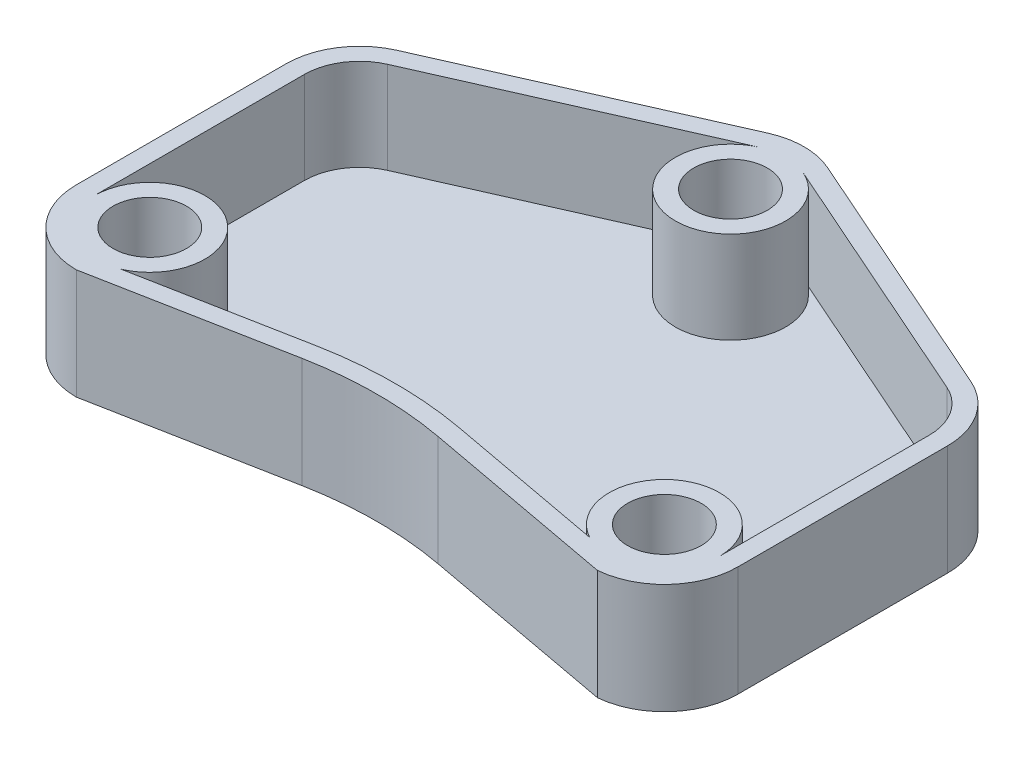
ISO-10303-21;
HEADER;
FILE_DESCRIPTION(('STEP AP214'),'2;1');
FILE_NAME('part.step','',(''),(''),'','','');
FILE_SCHEMA(('AUTOMOTIVE_DESIGN { 1 0 10303 214 1 1 1 1 }'));
ENDSEC;
DATA;
#1=APPLICATION_CONTEXT('core data for automotive mechanical design processes');
#2=APPLICATION_PROTOCOL_DEFINITION('international standard','automotive_design',2000,#1);
#3=PRODUCT_CONTEXT('',#1,'mechanical');
#4=PRODUCT('Part','Part','',(#3));
#5=PRODUCT_RELATED_PRODUCT_CATEGORY('part','',(#4));
#6=PRODUCT_DEFINITION_FORMATION('','',#4);
#7=PRODUCT_DEFINITION_CONTEXT('part definition',#1,'design');
#8=PRODUCT_DEFINITION('design','',#6,#7);
#9=PRODUCT_DEFINITION_SHAPE('','',#8);
#10=(LENGTH_UNIT() NAMED_UNIT(*) SI_UNIT(.MILLI.,.METRE.));
#11=(NAMED_UNIT(*) PLANE_ANGLE_UNIT() SI_UNIT($,.RADIAN.));
#12=(NAMED_UNIT(*) SI_UNIT($,.STERADIAN.) SOLID_ANGLE_UNIT());
#13=UNCERTAINTY_MEASURE_WITH_UNIT(LENGTH_MEASURE(1.E-05),#10,'distance_accuracy_value','');
#14=(GEOMETRIC_REPRESENTATION_CONTEXT(3) GLOBAL_UNCERTAINTY_ASSIGNED_CONTEXT((#13)) GLOBAL_UNIT_ASSIGNED_CONTEXT((#10,
#11,#12)) REPRESENTATION_CONTEXT('',''));
#15=CARTESIAN_POINT('',(0.,0.,0.));
#16=DIRECTION('',(0.,0.,1.));
#17=DIRECTION('',(1.,0.,0.));
#18=AXIS2_PLACEMENT_3D('',#15,#16,#17);
#19=CARTESIAN_POINT('',(0.,30.,0.));
#20=DIRECTION('',(0.,1.,0.));
#21=DIRECTION('',(0.,0.,1.));
#22=AXIS2_PLACEMENT_3D('',#19,#20,#21);
#23=PLANE('',#22);
#24=CARTESIAN_POINT('',(-70.,30.,0.));
#25=DIRECTION('',(0.,1.,0.));
#26=DIRECTION('',(0.,0.,1.));
#27=AXIS2_PLACEMENT_3D('',#24,#25,#26);
#28=CIRCLE('',#27,9.99999999999999);
#29=CARTESIAN_POINT('',(-70.,30.,9.99999999999999));
#30=VERTEX_POINT('',#29);
#31=EDGE_CURVE('E232',#30,#30,#28,.T.);
#32=ORIENTED_EDGE('',*,*,#31,.F.);
#33=EDGE_LOOP('',(#32));
#34=FACE_BOUND('',#33,.T.);
#35=CARTESIAN_POINT('',(70.,30.,0.));
#36=DIRECTION('',(0.,1.,0.));
#37=DIRECTION('',(0.,0.,1.));
#38=AXIS2_PLACEMENT_3D('',#35,#36,#37);
#39=CIRCLE('',#38,9.99999999999999);
#40=CARTESIAN_POINT('',(70.,30.,9.99999999999997));
#41=VERTEX_POINT('',#40);
#42=EDGE_CURVE('E708',#41,#41,#39,.T.);
#43=ORIENTED_EDGE('',*,*,#42,.F.);
#44=EDGE_LOOP('',(#43));
#45=FACE_BOUND('',#44,.T.);
#46=CARTESIAN_POINT('',(0.,30.,-88.));
#47=DIRECTION('',(0.,1.,0.));
#48=DIRECTION('',(0.,0.,1.));
#49=AXIS2_PLACEMENT_3D('',#46,#47,#48);
#50=CIRCLE('',#49,10.);
#51=CARTESIAN_POINT('',(0.,30.,-78.));
#52=VERTEX_POINT('',#51);
#53=EDGE_CURVE('E308',#52,#52,#50,.T.);
#54=ORIENTED_EDGE('',*,*,#53,.F.);
#55=EDGE_LOOP('',(#54));
#56=FACE_BOUND('',#55,.T.);
#57=DIRECTION('',(0.982241401983114,0.,-0.187621502579652));
#58=VECTOR('',#57,1.);
#59=CARTESIAN_POINT('',(1.22166417860307,30.,6.39569089387399));
#60=LINE('',#59,#58);
#61=CARTESIAN_POINT('',(-70.,30.,20.));
#62=VERTEX_POINT('',#61);
#63=CARTESIAN_POINT('',(-18.4919565902878,30.,10.1612612948744));
#64=VERTEX_POINT('',#63);
#65=EDGE_CURVE('E305',#62,#64,#60,.T.);
#66=ORIENTED_EDGE('',*,*,#65,.T.);
#67=CARTESIAN_POINT('',(0.270193667677759,30.,108.385401493186));
#68=DIRECTION('',(0.,1.,0.));
#69=DIRECTION('',(0.,0.,1.));
#70=AXIS2_PLACEMENT_3D('',#67,#68,#69);
#71=CIRCLE('',#70,100.);
#72=CARTESIAN_POINT('',(18.510453887129,30.,10.0630087887427));
#73=VERTEX_POINT('',#72);
#74=EDGE_CURVE('E117',#64,#73,#71,.F.);
#75=ORIENTED_EDGE('',*,*,#74,.T.);
#76=DIRECTION('',(0.98322392704443,0.,0.182402602194514));
#77=VECTOR('',#76,1.);
#78=CARTESIAN_POINT('',(-1.18887025844739,30.,6.40849236904212));
#79=LINE('',#78,#77);
#80=CARTESIAN_POINT('',(71.6895090197948,30.,19.9285112156436));
#81=VERTEX_POINT('',#80);
#82=EDGE_CURVE('E267',#73,#81,#79,.T.);
#83=ORIENTED_EDGE('',*,*,#82,.T.);
#84=CARTESIAN_POINT('',(70.,30.,0.));
#85=DIRECTION('',(0.,1.,0.));
#86=DIRECTION('',(0.,0.,1.));
#87=AXIS2_PLACEMENT_3D('',#84,#85,#86);
#88=CIRCLE('',#87,20.);
#89=CARTESIAN_POINT('',(90.,30.,0.));
#90=VERTEX_POINT('',#89);
#91=EDGE_CURVE('E285',#81,#90,#88,.T.);
#92=ORIENTED_EDGE('',*,*,#91,.T.);
#93=DIRECTION('',(0.,0.,-1.));
#94=VECTOR('',#93,1.);
#95=CARTESIAN_POINT('',(90.,30.,0.));
#96=LINE('',#95,#94);
#97=CARTESIAN_POINT('',(90.,30.,-57.0471372277702));
#98=VERTEX_POINT('',#97);
#99=EDGE_CURVE('E281',#90,#98,#96,.T.);
#100=ORIENTED_EDGE('',*,*,#99,.T.);
#101=CARTESIAN_POINT('',(70.,30.,-57.0471372277702));
#102=DIRECTION('',(0.,1.,0.));
#103=DIRECTION('',(0.,0.,1.));
#104=AXIS2_PLACEMENT_3D('',#101,#102,#103);
#105=CIRCLE('',#104,20.);
#106=CARTESIAN_POINT('',(78.0882241691455,30.,-75.3386825367279));
#107=VERTEX_POINT('',#106);
#108=EDGE_CURVE('E284',#98,#107,#105,.T.);
#109=ORIENTED_EDGE('',*,*,#108,.T.);
#110=DIRECTION('',(-0.914577265447882,0.,-0.404411208457277));
#111=VECTOR('',#110,1.);
#112=CARTESIAN_POINT('',(40.6363703181105,30.,-91.8992838626806));
#113=LINE('',#112,#111);
#114=CARTESIAN_POINT('',(8.08822416914554,30.,-106.291545308958));
#115=VERTEX_POINT('',#114);
#116=EDGE_CURVE('E289',#107,#115,#113,.T.);
#117=ORIENTED_EDGE('',*,*,#116,.T.);
#118=CARTESIAN_POINT('',(0.,30.,-88.));
#119=DIRECTION('',(0.,1.,0.));
#120=DIRECTION('',(0.,0.,1.));
#121=AXIS2_PLACEMENT_3D('',#118,#119,#120);
#122=CIRCLE('',#121,20.);
#123=CARTESIAN_POINT('',(-8.08822416914554,30.,-106.291545308958));
#124=VERTEX_POINT('',#123);
#125=EDGE_CURVE('E296',#124,#115,#122,.F.);
#126=ORIENTED_EDGE('',*,*,#125,.F.);
#127=DIRECTION('',(0.914577265447882,0.,-0.404411208457277));
#128=VECTOR('',#127,1.);
#129=CARTESIAN_POINT('',(-40.6363703181105,30.,-91.8992838626806));
#130=LINE('',#129,#128);
#131=CARTESIAN_POINT('',(-78.0882241691455,30.,-75.3386825367279));
#132=VERTEX_POINT('',#131);
#133=EDGE_CURVE('E156',#132,#124,#130,.T.);
#134=ORIENTED_EDGE('',*,*,#133,.F.);
#135=CARTESIAN_POINT('',(-70.,30.,-57.0471372277702));
#136=DIRECTION('',(0.,1.,0.));
#137=DIRECTION('',(0.,0.,1.));
#138=AXIS2_PLACEMENT_3D('',#135,#136,#137);
#139=CIRCLE('',#138,20.);
#140=CARTESIAN_POINT('',(-90.,30.,-57.0471372277702));
#141=VERTEX_POINT('',#140);
#142=EDGE_CURVE('E148',#132,#141,#139,.T.);
#143=ORIENTED_EDGE('',*,*,#142,.T.);
#144=DIRECTION('',(0.,0.,-1.));
#145=VECTOR('',#144,1.);
#146=CARTESIAN_POINT('',(-90.,30.,0.));
#147=LINE('',#146,#145);
#148=CARTESIAN_POINT('',(-90.,30.,0.));
#149=VERTEX_POINT('',#148);
#150=EDGE_CURVE('E153',#149,#141,#147,.T.);
#151=ORIENTED_EDGE('',*,*,#150,.F.);
#152=CARTESIAN_POINT('',(-70.,30.,0.));
#153=DIRECTION('',(0.,1.,0.));
#154=DIRECTION('',(0.,0.,1.));
#155=AXIS2_PLACEMENT_3D('',#152,#153,#154);
#156=CIRCLE('',#155,20.);
#157=EDGE_CURVE('E174',#62,#149,#156,.F.);
#158=ORIENTED_EDGE('',*,*,#157,.F.);
#159=EDGE_LOOP('',(#66,#75,#83,#92,#100,#109,#117,#126,#134,#143,#151,#158));
#160=FACE_BOUND('',#159,.T.);
#161=DIRECTION('',(0.914577265447882,0.,-0.404411208457277));
#162=VECTOR('',#161,1.);
#163=CARTESIAN_POINT('',(-38.6143142758241,30.,-87.3263975354412));
#164=LINE('',#163,#162);
#165=CARTESIAN_POINT('',(-76.0661681268591,30.,-70.7657962094885));
#166=VERTEX_POINT('',#165);
#167=CARTESIAN_POINT('',(-6.06616812685916,30.,-101.718658981718));
#168=VERTEX_POINT('',#167);
#169=EDGE_CURVE('E676',#166,#168,#164,.T.);
#170=ORIENTED_EDGE('',*,*,#169,.T.);
#171=CARTESIAN_POINT('',(0.,30.,-88.));
#172=DIRECTION('',(0.,1.,0.));
#173=DIRECTION('',(0.,0.,1.));
#174=AXIS2_PLACEMENT_3D('',#171,#172,#173);
#175=CIRCLE('',#174,15.);
#176=CARTESIAN_POINT('',(6.06616812685917,30.,-101.718658981718));
#177=VERTEX_POINT('',#176);
#178=EDGE_CURVE('E658',#168,#177,#175,.T.);
#179=ORIENTED_EDGE('',*,*,#178,.T.);
#180=DIRECTION('',(-0.914577265447882,0.,-0.404411208457277));
#181=VECTOR('',#180,1.);
#182=CARTESIAN_POINT('',(38.6143142758241,30.,-87.3263975354412));
#183=LINE('',#182,#181);
#184=CARTESIAN_POINT('',(76.0661681268591,30.,-70.7657962094885));
#185=VERTEX_POINT('',#184);
#186=EDGE_CURVE('E673',#185,#177,#183,.T.);
#187=ORIENTED_EDGE('',*,*,#186,.F.);
#188=CARTESIAN_POINT('',(70.,30.,-57.0471372277702));
#189=DIRECTION('',(0.,1.,0.));
#190=DIRECTION('',(0.,0.,1.));
#191=AXIS2_PLACEMENT_3D('',#188,#189,#190);
#192=CIRCLE('',#191,15.);
#193=CARTESIAN_POINT('',(85.,30.,-57.0471372277702));
#194=VERTEX_POINT('',#193);
#195=EDGE_CURVE('E670',#194,#185,#192,.T.);
#196=ORIENTED_EDGE('',*,*,#195,.F.);
#197=DIRECTION('',(0.,0.,-1.));
#198=VECTOR('',#197,1.);
#199=CARTESIAN_POINT('',(85.,30.,0.));
#200=LINE('',#199,#198);
#201=CARTESIAN_POINT('',(85.,30.,0.));
#202=VERTEX_POINT('',#201);
#203=EDGE_CURVE('E666',#202,#194,#200,.T.);
#204=ORIENTED_EDGE('',*,*,#203,.F.);
#205=CARTESIAN_POINT('',(70.,30.,0.));
#206=DIRECTION('',(0.,1.,0.));
#207=DIRECTION('',(0.,0.,1.));
#208=AXIS2_PLACEMENT_3D('',#205,#206,#207);
#209=CIRCLE('',#208,15.);
#210=CARTESIAN_POINT('',(62.898194489051,30.,13.212280593624));
#211=VERTEX_POINT('',#210);
#212=EDGE_CURVE('E690',#202,#211,#209,.T.);
#213=ORIENTED_EDGE('',*,*,#212,.T.);
#214=DIRECTION('',(0.98322392704443,0.,0.182402602194514));
#215=VECTOR('',#214,1.);
#216=CARTESIAN_POINT('',(-0.27685724747482,30.,1.49237273381997));
#217=LINE('',#216,#215);
#218=CARTESIAN_POINT('',(19.4224668981016,30.,5.14688915352057));
#219=VERTEX_POINT('',#218);
#220=EDGE_CURVE('E662',#219,#211,#217,.T.);
#221=ORIENTED_EDGE('',*,*,#220,.F.);
#222=CARTESIAN_POINT('',(0.270193667677759,30.,108.385401493186));
#223=DIRECTION('',(0.,1.,0.));
#224=DIRECTION('',(0.,0.,1.));
#225=AXIS2_PLACEMENT_3D('',#222,#223,#224);
#226=CIRCLE('',#225,105.);
#227=CARTESIAN_POINT('',(-19.4300641031861,30.,5.2500542849588));
#228=VERTEX_POINT('',#227);
#229=EDGE_CURVE('E657',#228,#219,#226,.F.);
#230=ORIENTED_EDGE('',*,*,#229,.F.);
#231=DIRECTION('',(0.982241401983114,0.,-0.187621502579652));
#232=VECTOR('',#231,1.);
#233=CARTESIAN_POINT('',(0.283556665704815,30.,1.48448388395842));
#234=LINE('',#233,#232);
#235=CARTESIAN_POINT('',(-64.0650953739565,30.,13.7759539444558));
#236=VERTEX_POINT('',#235);
#237=EDGE_CURVE('E653',#236,#228,#234,.T.);
#238=ORIENTED_EDGE('',*,*,#237,.F.);
#239=CARTESIAN_POINT('',(-70.,30.,0.));
#240=DIRECTION('',(0.,1.,0.));
#241=DIRECTION('',(0.,0.,1.));
#242=AXIS2_PLACEMENT_3D('',#239,#240,#241);
#243=CIRCLE('',#242,15.);
#244=CARTESIAN_POINT('',(-85.,30.,0.));
#245=VERTEX_POINT('',#244);
#246=EDGE_CURVE('E641',#236,#245,#243,.T.);
#247=ORIENTED_EDGE('',*,*,#246,.T.);
#248=DIRECTION('',(0.,0.,-1.));
#249=VECTOR('',#248,1.);
#250=CARTESIAN_POINT('',(-85.,30.,0.));
#251=LINE('',#250,#249);
#252=CARTESIAN_POINT('',(-85.,30.,-57.0471372277702));
#253=VERTEX_POINT('',#252);
#254=EDGE_CURVE('E645',#245,#253,#251,.T.);
#255=ORIENTED_EDGE('',*,*,#254,.T.);
#256=CARTESIAN_POINT('',(-70.,30.,-57.0471372277702));
#257=DIRECTION('',(0.,1.,0.));
#258=DIRECTION('',(0.,0.,1.));
#259=AXIS2_PLACEMENT_3D('',#256,#257,#258);
#260=CIRCLE('',#259,15.);
#261=EDGE_CURVE('E680',#166,#253,#260,.T.);
#262=ORIENTED_EDGE('',*,*,#261,.F.);
#263=EDGE_LOOP('',(#170,#179,#187,#196,#204,#213,#221,#230,#238,#247,#255,#262));
#264=FACE_BOUND('',#263,.T.);
#265=ADVANCED_FACE('F41',(#34,#45,#56,#160,#264),#23,.T.);
#266=CARTESIAN_POINT('',(1.22166417860307,30.,6.39569089387399));
#267=DIRECTION('',(-0.187621502579652,0.,-0.982241401983114));
#268=DIRECTION('',(-0.982241401983114,0.,0.187621502579652));
#269=AXIS2_PLACEMENT_3D('',#266,#267,#268);
#270=PLANE('',#269);
#271=DIRECTION('',(0.982241401983114,0.,-0.187621502579652));
#272=VECTOR('',#271,1.);
#273=CARTESIAN_POINT('',(1.22166417860307,0.,6.39569089387399));
#274=LINE('',#273,#272);
#275=CARTESIAN_POINT('',(-70.,0.,20.));
#276=VERTEX_POINT('',#275);
#277=CARTESIAN_POINT('',(-18.4919565902878,0.,10.1612612948744));
#278=VERTEX_POINT('',#277);
#279=EDGE_CURVE('E193',#276,#278,#274,.T.);
#280=ORIENTED_EDGE('',*,*,#279,.T.);
#281=DIRECTION('',(0.,-1.,0.));
#282=VECTOR('',#281,1.);
#283=CARTESIAN_POINT('',(-18.4919565902878,30.,10.1612612948744));
#284=LINE('',#283,#282);
#285=EDGE_CURVE('E11',#64,#278,#284,.T.);
#286=ORIENTED_EDGE('',*,*,#285,.F.);
#287=ORIENTED_EDGE('',*,*,#65,.F.);
#288=DIRECTION('',(0.,-1.,0.));
#289=VECTOR('',#288,1.);
#290=CARTESIAN_POINT('',(-70.,30.,20.));
#291=LINE('',#290,#289);
#292=EDGE_CURVE('E66',#62,#276,#291,.T.);
#293=ORIENTED_EDGE('',*,*,#292,.T.);
#294=EDGE_LOOP('',(#280,#286,#287,#293));
#295=FACE_BOUND('',#294,.T.);
#296=ADVANCED_FACE('F310',(#295),#270,.F.);
#297=CARTESIAN_POINT('',(0.270193667677759,30.,108.385401493186));
#298=DIRECTION('',(0.,-1.,0.));
#299=DIRECTION('',(0.,0.,-1.));
#300=AXIS2_PLACEMENT_3D('',#297,#298,#299);
#301=CYLINDRICAL_SURFACE('',#300,100.);
#302=CARTESIAN_POINT('',(0.270193667677759,0.,108.385401493186));
#303=DIRECTION('',(0.,1.,0.));
#304=DIRECTION('',(0.,0.,1.));
#305=AXIS2_PLACEMENT_3D('',#302,#303,#304);
#306=CIRCLE('',#305,100.);
#307=CARTESIAN_POINT('',(18.510453887129,0.,10.0630087887427));
#308=VERTEX_POINT('',#307);
#309=EDGE_CURVE('E196',#278,#308,#306,.F.);
#310=ORIENTED_EDGE('',*,*,#309,.T.);
#311=DIRECTION('',(0.,-1.,0.));
#312=VECTOR('',#311,1.);
#313=CARTESIAN_POINT('',(18.510453887129,30.,10.0630087887427));
#314=LINE('',#313,#312);
#315=EDGE_CURVE('E50',#73,#308,#314,.T.);
#316=ORIENTED_EDGE('',*,*,#315,.F.);
#317=ORIENTED_EDGE('',*,*,#74,.F.);
#318=ORIENTED_EDGE('',*,*,#285,.T.);
#319=EDGE_LOOP('',(#310,#316,#317,#318));
#320=FACE_BOUND('',#319,.T.);
#321=ADVANCED_FACE('F311',(#320),#301,.F.);
#322=CARTESIAN_POINT('',(-1.18887025844739,30.,6.40849236904212));
#323=DIRECTION('',(0.182402602194514,0.,-0.98322392704443));
#324=DIRECTION('',(-0.98322392704443,0.,-0.182402602194514));
#325=AXIS2_PLACEMENT_3D('',#322,#323,#324);
#326=PLANE('',#325);
#327=DIRECTION('',(0.98322392704443,0.,0.182402602194514));
#328=VECTOR('',#327,1.);
#329=CARTESIAN_POINT('',(-1.18887025844739,0.,6.40849236904212));
#330=LINE('',#329,#328);
#331=CARTESIAN_POINT('',(71.6895090197948,0.,19.9285112156436));
#332=VERTEX_POINT('',#331);
#333=EDGE_CURVE('E199',#308,#332,#330,.T.);
#334=ORIENTED_EDGE('',*,*,#333,.T.);
#335=DIRECTION('',(0.,-1.,0.));
#336=VECTOR('',#335,1.);
#337=CARTESIAN_POINT('',(71.6895090197948,30.,19.9285112156436));
#338=LINE('',#337,#336);
#339=EDGE_CURVE('E257',#81,#332,#338,.T.);
#340=ORIENTED_EDGE('',*,*,#339,.F.);
#341=ORIENTED_EDGE('',*,*,#82,.F.);
#342=ORIENTED_EDGE('',*,*,#315,.T.);
#343=EDGE_LOOP('',(#334,#340,#341,#342));
#344=FACE_BOUND('',#343,.T.);
#345=ADVANCED_FACE('F265',(#344),#326,.F.);
#346=CARTESIAN_POINT('',(70.,30.,0.));
#347=DIRECTION('',(0.,-1.,0.));
#348=DIRECTION('',(0.,0.,-1.));
#349=AXIS2_PLACEMENT_3D('',#346,#347,#348);
#350=CYLINDRICAL_SURFACE('',#349,20.);
#351=CARTESIAN_POINT('',(70.,0.,0.));
#352=DIRECTION('',(0.,1.,0.));
#353=DIRECTION('',(0.,0.,1.));
#354=AXIS2_PLACEMENT_3D('',#351,#352,#353);
#355=CIRCLE('',#354,20.);
#356=CARTESIAN_POINT('',(90.,0.,0.));
#357=VERTEX_POINT('',#356);
#358=EDGE_CURVE('E202',#332,#357,#355,.T.);
#359=ORIENTED_EDGE('',*,*,#358,.T.);
#360=DIRECTION('',(0.,-1.,0.));
#361=VECTOR('',#360,1.);
#362=CARTESIAN_POINT('',(90.,30.,0.));
#363=LINE('',#362,#361);
#364=EDGE_CURVE('E253',#90,#357,#363,.T.);
#365=ORIENTED_EDGE('',*,*,#364,.F.);
#366=ORIENTED_EDGE('',*,*,#91,.F.);
#367=ORIENTED_EDGE('',*,*,#339,.T.);
#368=EDGE_LOOP('',(#359,#365,#366,#367));
#369=FACE_BOUND('',#368,.T.);
#370=ADVANCED_FACE('F275',(#369),#350,.T.);
#371=CARTESIAN_POINT('',(90.,30.,0.));
#372=DIRECTION('',(-1.,0.,0.));
#373=DIRECTION('',(0.,0.,1.));
#374=AXIS2_PLACEMENT_3D('',#371,#372,#373);
#375=PLANE('',#374);
#376=DIRECTION('',(0.,0.,-1.));
#377=VECTOR('',#376,1.);
#378=CARTESIAN_POINT('',(90.,0.,0.));
#379=LINE('',#378,#377);
#380=CARTESIAN_POINT('',(90.,0.,-57.0471372277702));
#381=VERTEX_POINT('',#380);
#382=EDGE_CURVE('E205',#357,#381,#379,.T.);
#383=ORIENTED_EDGE('',*,*,#382,.T.);
#384=DIRECTION('',(0.,-1.,0.));
#385=VECTOR('',#384,1.);
#386=CARTESIAN_POINT('',(90.,30.,-57.0471372277702));
#387=LINE('',#386,#385);
#388=EDGE_CURVE('E249',#98,#381,#387,.T.);
#389=ORIENTED_EDGE('',*,*,#388,.F.);
#390=ORIENTED_EDGE('',*,*,#99,.F.);
#391=ORIENTED_EDGE('',*,*,#364,.T.);
#392=EDGE_LOOP('',(#383,#389,#390,#391));
#393=FACE_BOUND('',#392,.T.);
#394=ADVANCED_FACE('F279',(#393),#375,.F.);
#395=CARTESIAN_POINT('',(70.,30.,-57.0471372277702));
#396=DIRECTION('',(0.,-1.,0.));
#397=DIRECTION('',(0.,0.,-1.));
#398=AXIS2_PLACEMENT_3D('',#395,#396,#397);
#399=CYLINDRICAL_SURFACE('',#398,20.);
#400=CARTESIAN_POINT('',(70.,0.,-57.0471372277702));
#401=DIRECTION('',(0.,1.,0.));
#402=DIRECTION('',(0.,0.,1.));
#403=AXIS2_PLACEMENT_3D('',#400,#401,#402);
#404=CIRCLE('',#403,20.);
#405=CARTESIAN_POINT('',(78.0882241691455,0.,-75.3386825367279));
#406=VERTEX_POINT('',#405);
#407=EDGE_CURVE('E208',#381,#406,#404,.T.);
#408=ORIENTED_EDGE('',*,*,#407,.T.);
#409=DIRECTION('',(0.,-1.,0.));
#410=VECTOR('',#409,1.);
#411=CARTESIAN_POINT('',(78.0882241691455,30.,-75.3386825367279));
#412=LINE('',#411,#410);
#413=EDGE_CURVE('E245',#107,#406,#412,.T.);
#414=ORIENTED_EDGE('',*,*,#413,.F.);
#415=ORIENTED_EDGE('',*,*,#108,.F.);
#416=ORIENTED_EDGE('',*,*,#388,.T.);
#417=EDGE_LOOP('',(#408,#414,#415,#416));
#418=FACE_BOUND('',#417,.T.);
#419=ADVANCED_FACE('F351',(#418),#399,.T.);
#420=CARTESIAN_POINT('',(40.6363703181105,30.,-91.8992838626806));
#421=DIRECTION('',(-0.404411208457277,0.,0.914577265447882));
#422=DIRECTION('',(0.914577265447882,0.,0.404411208457277));
#423=AXIS2_PLACEMENT_3D('',#420,#421,#422);
#424=PLANE('',#423);
#425=DIRECTION('',(-0.914577265447882,0.,-0.404411208457277));
#426=VECTOR('',#425,1.);
#427=CARTESIAN_POINT('',(40.6363703181105,0.,-91.8992838626806));
#428=LINE('',#427,#426);
#429=CARTESIAN_POINT('',(8.08822416914554,0.,-106.291545308958));
#430=VERTEX_POINT('',#429);
#431=EDGE_CURVE('E211',#406,#430,#428,.T.);
#432=ORIENTED_EDGE('',*,*,#431,.T.);
#433=DIRECTION('',(0.,-1.,0.));
#434=VECTOR('',#433,1.);
#435=CARTESIAN_POINT('',(8.08822416914554,30.,-106.291545308958));
#436=LINE('',#435,#434);
#437=EDGE_CURVE('E242',#115,#430,#436,.T.);
#438=ORIENTED_EDGE('',*,*,#437,.F.);
#439=ORIENTED_EDGE('',*,*,#116,.F.);
#440=ORIENTED_EDGE('',*,*,#413,.T.);
#441=EDGE_LOOP('',(#432,#438,#439,#440));
#442=FACE_BOUND('',#441,.T.);
#443=ADVANCED_FACE('F347',(#442),#424,.F.);
#444=CARTESIAN_POINT('',(0.,30.,-88.));
#445=DIRECTION('',(0.,-1.,0.));
#446=DIRECTION('',(0.,0.,-1.));
#447=AXIS2_PLACEMENT_3D('',#444,#445,#446);
#448=CYLINDRICAL_SURFACE('',#447,20.);
#449=CARTESIAN_POINT('',(0.,0.,-88.));
#450=DIRECTION('',(0.,1.,0.));
#451=DIRECTION('',(0.,0.,1.));
#452=AXIS2_PLACEMENT_3D('',#449,#450,#451);
#453=CIRCLE('',#452,20.);
#454=CARTESIAN_POINT('',(-8.08822416914554,0.,-106.291545308958));
#455=VERTEX_POINT('',#454);
#456=EDGE_CURVE('E215',#455,#430,#453,.F.);
#457=ORIENTED_EDGE('',*,*,#456,.F.);
#458=DIRECTION('',(0.,-1.,0.));
#459=VECTOR('',#458,1.);
#460=CARTESIAN_POINT('',(-8.08822416914554,30.,-106.291545308958));
#461=LINE('',#460,#459);
#462=EDGE_CURVE('E239',#124,#455,#461,.T.);
#463=ORIENTED_EDGE('',*,*,#462,.F.);
#464=ORIENTED_EDGE('',*,*,#125,.T.);
#465=ORIENTED_EDGE('',*,*,#437,.T.);
#466=EDGE_LOOP('',(#457,#463,#464,#465));
#467=FACE_BOUND('',#466,.T.);
#468=ADVANCED_FACE('F344',(#467),#448,.T.);
#469=CARTESIAN_POINT('',(-40.6363703181105,30.,-91.8992838626806));
#470=DIRECTION('',(-0.404411208457277,0.,-0.914577265447882));
#471=DIRECTION('',(-0.914577265447882,0.,0.404411208457277));
#472=AXIS2_PLACEMENT_3D('',#469,#470,#471);
#473=PLANE('',#472);
#474=DIRECTION('',(0.914577265447882,0.,-0.404411208457277));
#475=VECTOR('',#474,1.);
#476=CARTESIAN_POINT('',(-40.6363703181105,0.,-91.8992838626806));
#477=LINE('',#476,#475);
#478=CARTESIAN_POINT('',(-78.0882241691455,0.,-75.3386825367279));
#479=VERTEX_POINT('',#478);
#480=EDGE_CURVE('E219',#479,#455,#477,.T.);
#481=ORIENTED_EDGE('',*,*,#480,.F.);
#482=DIRECTION('',(0.,-1.,0.));
#483=VECTOR('',#482,1.);
#484=CARTESIAN_POINT('',(-78.0882241691455,30.,-75.3386825367279));
#485=LINE('',#484,#483);
#486=EDGE_CURVE('E169',#132,#479,#485,.T.);
#487=ORIENTED_EDGE('',*,*,#486,.F.);
#488=ORIENTED_EDGE('',*,*,#133,.T.);
#489=ORIENTED_EDGE('',*,*,#462,.T.);
#490=EDGE_LOOP('',(#481,#487,#488,#489));
#491=FACE_BOUND('',#490,.T.);
#492=ADVANCED_FACE('F302',(#491),#473,.T.);
#493=CARTESIAN_POINT('',(-70.,30.,-57.0471372277702));
#494=DIRECTION('',(0.,-1.,0.));
#495=DIRECTION('',(0.,0.,-1.));
#496=AXIS2_PLACEMENT_3D('',#493,#494,#495);
#497=CYLINDRICAL_SURFACE('',#496,20.);
#498=CARTESIAN_POINT('',(-70.,0.,-57.0471372277702));
#499=DIRECTION('',(0.,1.,0.));
#500=DIRECTION('',(0.,0.,1.));
#501=AXIS2_PLACEMENT_3D('',#498,#499,#500);
#502=CIRCLE('',#501,20.);
#503=CARTESIAN_POINT('',(-90.,0.,-57.0471372277702));
#504=VERTEX_POINT('',#503);
#505=EDGE_CURVE('E164',#479,#504,#502,.T.);
#506=ORIENTED_EDGE('',*,*,#505,.T.);
#507=DIRECTION('',(0.,-1.,0.));
#508=VECTOR('',#507,1.);
#509=CARTESIAN_POINT('',(-90.,30.,-57.0471372277702));
#510=LINE('',#509,#508);
#511=EDGE_CURVE('E161',#141,#504,#510,.T.);
#512=ORIENTED_EDGE('',*,*,#511,.F.);
#513=ORIENTED_EDGE('',*,*,#142,.F.);
#514=ORIENTED_EDGE('',*,*,#486,.T.);
#515=EDGE_LOOP('',(#506,#512,#513,#514));
#516=FACE_BOUND('',#515,.T.);
#517=ADVANCED_FACE('F162',(#516),#497,.T.);
#518=CARTESIAN_POINT('',(-90.,30.,0.));
#519=DIRECTION('',(-1.,0.,0.));
#520=DIRECTION('',(0.,0.,1.));
#521=AXIS2_PLACEMENT_3D('',#518,#519,#520);
#522=PLANE('',#521);
#523=DIRECTION('',(0.,0.,-1.));
#524=VECTOR('',#523,1.);
#525=CARTESIAN_POINT('',(-90.,0.,0.));
#526=LINE('',#525,#524);
#527=CARTESIAN_POINT('',(-90.,0.,0.));
#528=VERTEX_POINT('',#527);
#529=EDGE_CURVE('E225',#528,#504,#526,.T.);
#530=ORIENTED_EDGE('',*,*,#529,.F.);
#531=DIRECTION('',(0.,-1.,0.));
#532=VECTOR('',#531,1.);
#533=CARTESIAN_POINT('',(-90.,30.,0.));
#534=LINE('',#533,#532);
#535=EDGE_CURVE('E170',#149,#528,#534,.T.);
#536=ORIENTED_EDGE('',*,*,#535,.F.);
#537=ORIENTED_EDGE('',*,*,#150,.T.);
#538=ORIENTED_EDGE('',*,*,#511,.T.);
#539=EDGE_LOOP('',(#530,#536,#537,#538));
#540=FACE_BOUND('',#539,.T.);
#541=ADVANCED_FACE('F172',(#540),#522,.T.);
#542=CARTESIAN_POINT('',(0.,30.,-88.));
#543=DIRECTION('',(0.,-1.,0.));
#544=DIRECTION('',(0.,0.,-1.));
#545=AXIS2_PLACEMENT_3D('',#542,#543,#544);
#546=CYLINDRICAL_SURFACE('',#545,10.);
#547=ORIENTED_EDGE('',*,*,#53,.T.);
#548=EDGE_LOOP('',(#547));
#549=FACE_BOUND('',#548,.T.);
#550=CARTESIAN_POINT('',(0.,0.,-88.));
#551=DIRECTION('',(0.,1.,0.));
#552=DIRECTION('',(0.,0.,1.));
#553=AXIS2_PLACEMENT_3D('',#550,#551,#552);
#554=CIRCLE('',#553,10.);
#555=CARTESIAN_POINT('',(0.,0.,-78.));
#556=VERTEX_POINT('',#555);
#557=EDGE_CURVE('E189',#556,#556,#554,.T.);
#558=ORIENTED_EDGE('',*,*,#557,.F.);
#559=EDGE_LOOP('',(#558));
#560=FACE_BOUND('',#559,.T.);
#561=ADVANCED_FACE('F339',(#549,#560),#546,.F.);
#562=CARTESIAN_POINT('',(70.,30.,0.));
#563=DIRECTION('',(0.,-1.,0.));
#564=DIRECTION('',(0.,0.,-1.));
#565=AXIS2_PLACEMENT_3D('',#562,#563,#564);
#566=CYLINDRICAL_SURFACE('',#565,9.99999999999999);
#567=ORIENTED_EDGE('',*,*,#42,.T.);
#568=EDGE_LOOP('',(#567));
#569=FACE_BOUND('',#568,.T.);
#570=CARTESIAN_POINT('',(70.,0.,0.));
#571=DIRECTION('',(0.,1.,0.));
#572=DIRECTION('',(0.,0.,1.));
#573=AXIS2_PLACEMENT_3D('',#570,#571,#572);
#574=CIRCLE('',#573,9.99999999999999);
#575=CARTESIAN_POINT('',(70.,0.,9.99999999999997));
#576=VERTEX_POINT('',#575);
#577=EDGE_CURVE('E184',#576,#576,#574,.T.);
#578=ORIENTED_EDGE('',*,*,#577,.F.);
#579=EDGE_LOOP('',(#578));
#580=FACE_BOUND('',#579,.T.);
#581=ADVANCED_FACE('F397',(#569,#580),#566,.F.);
#582=CARTESIAN_POINT('',(-70.,30.,0.));
#583=DIRECTION('',(0.,-1.,0.));
#584=DIRECTION('',(0.,0.,-1.));
#585=AXIS2_PLACEMENT_3D('',#582,#583,#584);
#586=CYLINDRICAL_SURFACE('',#585,9.99999999999999);
#587=ORIENTED_EDGE('',*,*,#31,.T.);
#588=EDGE_LOOP('',(#587));
#589=FACE_BOUND('',#588,.T.);
#590=CARTESIAN_POINT('',(-70.,0.,0.));
#591=DIRECTION('',(0.,1.,0.));
#592=DIRECTION('',(0.,0.,1.));
#593=AXIS2_PLACEMENT_3D('',#590,#591,#592);
#594=CIRCLE('',#593,9.99999999999999);
#595=CARTESIAN_POINT('',(-70.,0.,9.99999999999999));
#596=VERTEX_POINT('',#595);
#597=EDGE_CURVE('E180',#596,#596,#594,.T.);
#598=ORIENTED_EDGE('',*,*,#597,.F.);
#599=EDGE_LOOP('',(#598));
#600=FACE_BOUND('',#599,.T.);
#601=ADVANCED_FACE('F43',(#589,#600),#586,.F.);
#602=CARTESIAN_POINT('',(-70.,30.,0.));
#603=DIRECTION('',(0.,-1.,0.));
#604=DIRECTION('',(0.,0.,-1.));
#605=AXIS2_PLACEMENT_3D('',#602,#603,#604);
#606=CYLINDRICAL_SURFACE('',#605,20.);
#607=CARTESIAN_POINT('',(-70.,0.,0.));
#608=DIRECTION('',(0.,1.,0.));
#609=DIRECTION('',(0.,0.,1.));
#610=AXIS2_PLACEMENT_3D('',#607,#608,#609);
#611=CIRCLE('',#610,20.);
#612=EDGE_CURVE('E228',#276,#528,#611,.F.);
#613=ORIENTED_EDGE('',*,*,#612,.F.);
#614=ORIENTED_EDGE('',*,*,#292,.F.);
#615=ORIENTED_EDGE('',*,*,#157,.T.);
#616=ORIENTED_EDGE('',*,*,#535,.T.);
#617=EDGE_LOOP('',(#613,#614,#615,#616));
#618=FACE_BOUND('',#617,.T.);
#619=ADVANCED_FACE('F304',(#618),#606,.T.);
#620=CARTESIAN_POINT('',(0.,0.,0.));
#621=DIRECTION('',(0.,1.,0.));
#622=DIRECTION('',(0.,0.,1.));
#623=AXIS2_PLACEMENT_3D('',#620,#621,#622);
#624=PLANE('',#623);
#625=ORIENTED_EDGE('',*,*,#597,.T.);
#626=EDGE_LOOP('',(#625));
#627=FACE_BOUND('',#626,.T.);
#628=ORIENTED_EDGE('',*,*,#577,.T.);
#629=EDGE_LOOP('',(#628));
#630=FACE_BOUND('',#629,.T.);
#631=ORIENTED_EDGE('',*,*,#557,.T.);
#632=EDGE_LOOP('',(#631));
#633=FACE_BOUND('',#632,.T.);
#634=ORIENTED_EDGE('',*,*,#279,.F.);
#635=ORIENTED_EDGE('',*,*,#612,.T.);
#636=ORIENTED_EDGE('',*,*,#529,.T.);
#637=ORIENTED_EDGE('',*,*,#505,.F.);
#638=ORIENTED_EDGE('',*,*,#480,.T.);
#639=ORIENTED_EDGE('',*,*,#456,.T.);
#640=ORIENTED_EDGE('',*,*,#431,.F.);
#641=ORIENTED_EDGE('',*,*,#407,.F.);
#642=ORIENTED_EDGE('',*,*,#382,.F.);
#643=ORIENTED_EDGE('',*,*,#358,.F.);
#644=ORIENTED_EDGE('',*,*,#333,.F.);
#645=ORIENTED_EDGE('',*,*,#309,.F.);
#646=EDGE_LOOP('',(#634,#635,#636,#637,#638,#639,#640,#641,#642,#643,#644,#645));
#647=FACE_BOUND('',#646,.T.);
#648=ADVANCED_FACE('F270',(#627,#630,#633,#647),#624,.F.);
#649=CARTESIAN_POINT('',(-70.,30.,0.));
#650=DIRECTION('',(0.,-1.,0.));
#651=DIRECTION('',(0.,0.,-1.));
#652=AXIS2_PLACEMENT_3D('',#649,#650,#651);
#653=CYLINDRICAL_SURFACE('',#652,15.);
#654=DIRECTION('',(0.,-1.,0.));
#655=VECTOR('',#654,1.);
#656=CARTESIAN_POINT('',(-85.,30.,0.));
#657=LINE('',#656,#655);
#658=CARTESIAN_POINT('',(-85.,5.,0.));
#659=VERTEX_POINT('',#658);
#660=EDGE_CURVE('E637',#245,#659,#657,.T.);
#661=ORIENTED_EDGE('',*,*,#660,.F.);
#662=ORIENTED_EDGE('',*,*,#246,.F.);
#663=DIRECTION('',(0.,-1.,0.));
#664=VECTOR('',#663,1.);
#665=CARTESIAN_POINT('',(-64.0650953739565,30.,13.7759539444558));
#666=LINE('',#665,#664);
#667=CARTESIAN_POINT('',(-64.0650953739565,5.,13.7759539444558));
#668=VERTEX_POINT('',#667);
#669=EDGE_CURVE('E185',#668,#236,#666,.F.);
#670=ORIENTED_EDGE('',*,*,#669,.F.);
#671=CARTESIAN_POINT('',(-70.,5.,0.));
#672=DIRECTION('',(0.,1.,0.));
#673=DIRECTION('',(0.,0.,1.));
#674=AXIS2_PLACEMENT_3D('',#671,#672,#673);
#675=CIRCLE('',#674,15.);
#676=EDGE_CURVE('E646',#668,#659,#675,.T.);
#677=ORIENTED_EDGE('',*,*,#676,.T.);
#678=EDGE_LOOP('',(#661,#662,#670,#677));
#679=FACE_BOUND('',#678,.T.);
#680=ADVANCED_FACE('F333',(#679),#653,.T.);
#681=CARTESIAN_POINT('',(0.283556665704815,30.,1.48448388395842));
#682=DIRECTION('',(-0.187621502579652,0.,-0.982241401983114));
#683=DIRECTION('',(-0.982241401983114,0.,0.187621502579652));
#684=AXIS2_PLACEMENT_3D('',#681,#682,#683);
#685=PLANE('',#684);
#686=ORIENTED_EDGE('',*,*,#669,.T.);
#687=ORIENTED_EDGE('',*,*,#237,.T.);
#688=DIRECTION('',(0.,-1.,0.));
#689=VECTOR('',#688,1.);
#690=CARTESIAN_POINT('',(-19.4300641031861,30.,5.2500542849588));
#691=LINE('',#690,#689);
#692=CARTESIAN_POINT('',(-19.4300641031861,5.,5.2500542849588));
#693=VERTEX_POINT('',#692);
#694=EDGE_CURVE('E701',#228,#693,#691,.T.);
#695=ORIENTED_EDGE('',*,*,#694,.T.);
#696=DIRECTION('',(0.982241401983114,0.,-0.187621502579652));
#697=VECTOR('',#696,1.);
#698=CARTESIAN_POINT('',(0.283556665704815,5.,1.48448388395842));
#699=LINE('',#698,#697);
#700=EDGE_CURVE('E608',#668,#693,#699,.T.);
#701=ORIENTED_EDGE('',*,*,#700,.F.);
#702=EDGE_LOOP('',(#686,#687,#695,#701));
#703=FACE_BOUND('',#702,.T.);
#704=ADVANCED_FACE('F425',(#703),#685,.T.);
#705=CARTESIAN_POINT('',(0.270193667677759,30.,108.385401493186));
#706=DIRECTION('',(0.,-1.,0.));
#707=DIRECTION('',(0.,0.,-1.));
#708=AXIS2_PLACEMENT_3D('',#705,#706,#707);
#709=CYLINDRICAL_SURFACE('',#708,105.);
#710=CARTESIAN_POINT('',(0.270193667677759,5.,108.385401493186));
#711=DIRECTION('',(0.,1.,0.));
#712=DIRECTION('',(0.,0.,1.));
#713=AXIS2_PLACEMENT_3D('',#710,#711,#712);
#714=CIRCLE('',#713,105.);
#715=CARTESIAN_POINT('',(19.4224668981016,5.,5.14688915352057));
#716=VERTEX_POINT('',#715);
#717=EDGE_CURVE('E791',#693,#716,#714,.F.);
#718=ORIENTED_EDGE('',*,*,#717,.F.);
#719=ORIENTED_EDGE('',*,*,#694,.F.);
#720=ORIENTED_EDGE('',*,*,#229,.T.);
#721=DIRECTION('',(0.,1.,0.));
#722=VECTOR('',#721,1.);
#723=CARTESIAN_POINT('',(19.4224668981016,30.,5.14688915352057));
#724=LINE('',#723,#722);
#725=EDGE_CURVE('E720',#219,#716,#724,.F.);
#726=ORIENTED_EDGE('',*,*,#725,.T.);
#727=EDGE_LOOP('',(#718,#719,#720,#726));
#728=FACE_BOUND('',#727,.T.);
#729=ADVANCED_FACE('F432',(#728),#709,.T.);
#730=CARTESIAN_POINT('',(-0.27685724747482,30.,1.49237273381997));
#731=DIRECTION('',(0.182402602194514,0.,-0.98322392704443));
#732=DIRECTION('',(-0.98322392704443,0.,-0.182402602194514));
#733=AXIS2_PLACEMENT_3D('',#730,#731,#732);
#734=PLANE('',#733);
#735=DIRECTION('',(0.98322392704443,0.,0.182402602194514));
#736=VECTOR('',#735,1.);
#737=CARTESIAN_POINT('',(-0.27685724747482,5.,1.49237273381997));
#738=LINE('',#737,#736);
#739=CARTESIAN_POINT('',(62.898194489051,5.,13.212280593624));
#740=VERTEX_POINT('',#739);
#741=EDGE_CURVE('E787',#716,#740,#738,.T.);
#742=ORIENTED_EDGE('',*,*,#741,.F.);
#743=ORIENTED_EDGE('',*,*,#725,.F.);
#744=ORIENTED_EDGE('',*,*,#220,.T.);
#745=DIRECTION('',(0.,-1.,0.));
#746=VECTOR('',#745,1.);
#747=CARTESIAN_POINT('',(62.898194489051,30.,13.212280593624));
#748=LINE('',#747,#746);
#749=EDGE_CURVE('E697',#740,#211,#748,.F.);
#750=ORIENTED_EDGE('',*,*,#749,.F.);
#751=EDGE_LOOP('',(#742,#743,#744,#750));
#752=FACE_BOUND('',#751,.T.);
#753=ADVANCED_FACE('F440',(#752),#734,.T.);
#754=CARTESIAN_POINT('',(85.,30.,0.));
#755=DIRECTION('',(-1.,0.,0.));
#756=DIRECTION('',(0.,0.,1.));
#757=AXIS2_PLACEMENT_3D('',#754,#755,#756);
#758=PLANE('',#757);
#759=DIRECTION('',(0.,0.,-1.));
#760=VECTOR('',#759,1.);
#761=CARTESIAN_POINT('',(85.,5.,0.));
#762=LINE('',#761,#760);
#763=CARTESIAN_POINT('',(85.,5.,0.));
#764=VERTEX_POINT('',#763);
#765=CARTESIAN_POINT('',(85.,5.,-57.0471372277702));
#766=VERTEX_POINT('',#765);
#767=EDGE_CURVE('E784',#764,#766,#762,.T.);
#768=ORIENTED_EDGE('',*,*,#767,.F.);
#769=DIRECTION('',(0.,1.,0.));
#770=VECTOR('',#769,1.);
#771=CARTESIAN_POINT('',(85.,30.,0.));
#772=LINE('',#771,#770);
#773=EDGE_CURVE('E724',#202,#764,#772,.F.);
#774=ORIENTED_EDGE('',*,*,#773,.F.);
#775=ORIENTED_EDGE('',*,*,#203,.T.);
#776=DIRECTION('',(0.,-1.,0.));
#777=VECTOR('',#776,1.);
#778=CARTESIAN_POINT('',(85.,30.,-57.0471372277702));
#779=LINE('',#778,#777);
#780=EDGE_CURVE('E728',#194,#766,#779,.T.);
#781=ORIENTED_EDGE('',*,*,#780,.T.);
#782=EDGE_LOOP('',(#768,#774,#775,#781));
#783=FACE_BOUND('',#782,.T.);
#784=ADVANCED_FACE('F448',(#783),#758,.T.);
#785=CARTESIAN_POINT('',(70.,30.,-57.0471372277702));
#786=DIRECTION('',(0.,-1.,0.));
#787=DIRECTION('',(0.,0.,-1.));
#788=AXIS2_PLACEMENT_3D('',#785,#786,#787);
#789=CYLINDRICAL_SURFACE('',#788,15.);
#790=CARTESIAN_POINT('',(70.,5.,-57.0471372277702));
#791=DIRECTION('',(0.,1.,0.));
#792=DIRECTION('',(0.,0.,1.));
#793=AXIS2_PLACEMENT_3D('',#790,#791,#792);
#794=CIRCLE('',#793,15.);
#795=CARTESIAN_POINT('',(76.0661681268591,5.,-70.7657962094885));
#796=VERTEX_POINT('',#795);
#797=EDGE_CURVE('E626',#766,#796,#794,.T.);
#798=ORIENTED_EDGE('',*,*,#797,.F.);
#799=ORIENTED_EDGE('',*,*,#780,.F.);
#800=ORIENTED_EDGE('',*,*,#195,.T.);
#801=DIRECTION('',(0.,1.,0.));
#802=VECTOR('',#801,1.);
#803=CARTESIAN_POINT('',(76.0661681268591,30.,-70.7657962094885));
#804=LINE('',#803,#802);
#805=EDGE_CURVE('E57',#185,#796,#804,.F.);
#806=ORIENTED_EDGE('',*,*,#805,.T.);
#807=EDGE_LOOP('',(#798,#799,#800,#806));
#808=FACE_BOUND('',#807,.T.);
#809=ADVANCED_FACE('F456',(#808),#789,.F.);
#810=CARTESIAN_POINT('',(38.6143142758241,30.,-87.3263975354412));
#811=DIRECTION('',(-0.404411208457277,0.,0.914577265447882));
#812=DIRECTION('',(0.914577265447882,0.,0.404411208457277));
#813=AXIS2_PLACEMENT_3D('',#810,#811,#812);
#814=PLANE('',#813);
#815=DIRECTION('',(-0.914577265447882,0.,-0.404411208457277));
#816=VECTOR('',#815,1.);
#817=CARTESIAN_POINT('',(38.6143142758241,5.,-87.3263975354412));
#818=LINE('',#817,#816);
#819=CARTESIAN_POINT('',(6.06616812685916,5.,-101.718658981718));
#820=VERTEX_POINT('',#819);
#821=EDGE_CURVE('E602',#796,#820,#818,.T.);
#822=ORIENTED_EDGE('',*,*,#821,.F.);
#823=ORIENTED_EDGE('',*,*,#805,.F.);
#824=ORIENTED_EDGE('',*,*,#186,.T.);
#825=DIRECTION('',(0.,-1.,0.));
#826=VECTOR('',#825,1.);
#827=CARTESIAN_POINT('',(6.06616812685916,30.,-101.718658981718));
#828=LINE('',#827,#826);
#829=EDGE_CURVE('E734',#177,#820,#828,.T.);
#830=ORIENTED_EDGE('',*,*,#829,.T.);
#831=EDGE_LOOP('',(#822,#823,#824,#830));
#832=FACE_BOUND('',#831,.T.);
#833=ADVANCED_FACE('F464',(#832),#814,.T.);
#834=CARTESIAN_POINT('',(-38.6143142758241,30.,-87.3263975354412));
#835=DIRECTION('',(-0.404411208457277,0.,-0.914577265447882));
#836=DIRECTION('',(-0.914577265447882,0.,0.404411208457277));
#837=AXIS2_PLACEMENT_3D('',#834,#835,#836);
#838=PLANE('',#837);
#839=DIRECTION('',(0.914577265447882,0.,-0.404411208457277));
#840=VECTOR('',#839,1.);
#841=CARTESIAN_POINT('',(-38.6143142758241,5.,-87.3263975354412));
#842=LINE('',#841,#840);
#843=CARTESIAN_POINT('',(-76.0661681268591,5.,-70.7657962094885));
#844=VERTEX_POINT('',#843);
#845=CARTESIAN_POINT('',(-6.06616812685917,5.,-101.718658981718));
#846=VERTEX_POINT('',#845);
#847=EDGE_CURVE('E599',#844,#846,#842,.T.);
#848=ORIENTED_EDGE('',*,*,#847,.T.);
#849=DIRECTION('',(0.,1.,0.));
#850=VECTOR('',#849,1.);
#851=CARTESIAN_POINT('',(-6.06616812685916,30.,-101.718658981718));
#852=LINE('',#851,#850);
#853=EDGE_CURVE('E614',#168,#846,#852,.F.);
#854=ORIENTED_EDGE('',*,*,#853,.F.);
#855=ORIENTED_EDGE('',*,*,#169,.F.);
#856=DIRECTION('',(0.,-1.,0.));
#857=VECTOR('',#856,1.);
#858=CARTESIAN_POINT('',(-76.0661681268591,30.,-70.7657962094885));
#859=LINE('',#858,#857);
#860=EDGE_CURVE('E617',#166,#844,#859,.T.);
#861=ORIENTED_EDGE('',*,*,#860,.T.);
#862=EDGE_LOOP('',(#848,#854,#855,#861));
#863=FACE_BOUND('',#862,.T.);
#864=ADVANCED_FACE('F472',(#863),#838,.F.);
#865=CARTESIAN_POINT('',(-70.,30.,-57.0471372277702));
#866=DIRECTION('',(0.,-1.,0.));
#867=DIRECTION('',(0.,0.,-1.));
#868=AXIS2_PLACEMENT_3D('',#865,#866,#867);
#869=CYLINDRICAL_SURFACE('',#868,15.);
#870=CARTESIAN_POINT('',(-70.,5.,-57.0471372277702));
#871=DIRECTION('',(0.,1.,0.));
#872=DIRECTION('',(0.,0.,1.));
#873=AXIS2_PLACEMENT_3D('',#870,#871,#872);
#874=CIRCLE('',#873,15.);
#875=CARTESIAN_POINT('',(-85.,5.,-57.0471372277702));
#876=VERTEX_POINT('',#875);
#877=EDGE_CURVE('E620',#844,#876,#874,.T.);
#878=ORIENTED_EDGE('',*,*,#877,.F.);
#879=ORIENTED_EDGE('',*,*,#860,.F.);
#880=ORIENTED_EDGE('',*,*,#261,.T.);
#881=DIRECTION('',(0.,1.,0.));
#882=VECTOR('',#881,1.);
#883=CARTESIAN_POINT('',(-85.,30.,-57.0471372277702));
#884=LINE('',#883,#882);
#885=EDGE_CURVE('E632',#253,#876,#884,.F.);
#886=ORIENTED_EDGE('',*,*,#885,.T.);
#887=EDGE_LOOP('',(#878,#879,#880,#886));
#888=FACE_BOUND('',#887,.T.);
#889=ADVANCED_FACE('F479',(#888),#869,.F.);
#890=CARTESIAN_POINT('',(-85.,30.,0.));
#891=DIRECTION('',(-1.,0.,0.));
#892=DIRECTION('',(0.,0.,1.));
#893=AXIS2_PLACEMENT_3D('',#890,#891,#892);
#894=PLANE('',#893);
#895=DIRECTION('',(0.,0.,-1.));
#896=VECTOR('',#895,1.);
#897=CARTESIAN_POINT('',(-85.,5.,0.));
#898=LINE('',#897,#896);
#899=EDGE_CURVE('E624',#659,#876,#898,.T.);
#900=ORIENTED_EDGE('',*,*,#899,.T.);
#901=ORIENTED_EDGE('',*,*,#885,.F.);
#902=ORIENTED_EDGE('',*,*,#254,.F.);
#903=ORIENTED_EDGE('',*,*,#660,.T.);
#904=EDGE_LOOP('',(#900,#901,#902,#903));
#905=FACE_BOUND('',#904,.T.);
#906=ADVANCED_FACE('F487',(#905),#894,.F.);
#907=CARTESIAN_POINT('',(0.,30.,-88.));
#908=DIRECTION('',(0.,-1.,0.));
#909=DIRECTION('',(0.,0.,-1.));
#910=AXIS2_PLACEMENT_3D('',#907,#908,#909);
#911=CYLINDRICAL_SURFACE('',#910,15.);
#912=ORIENTED_EDGE('',*,*,#829,.F.);
#913=ORIENTED_EDGE('',*,*,#178,.F.);
#914=ORIENTED_EDGE('',*,*,#853,.T.);
#915=CARTESIAN_POINT('',(0.,5.,-88.));
#916=DIRECTION('',(0.,1.,0.));
#917=DIRECTION('',(0.,0.,1.));
#918=AXIS2_PLACEMENT_3D('',#915,#916,#917);
#919=CIRCLE('',#918,15.);
#920=EDGE_CURVE('E595',#846,#820,#919,.T.);
#921=ORIENTED_EDGE('',*,*,#920,.T.);
#922=EDGE_LOOP('',(#912,#913,#914,#921));
#923=FACE_BOUND('',#922,.T.);
#924=ADVANCED_FACE('F495',(#923),#911,.T.);
#925=CARTESIAN_POINT('',(70.,30.,0.));
#926=DIRECTION('',(0.,-1.,0.));
#927=DIRECTION('',(0.,0.,-1.));
#928=AXIS2_PLACEMENT_3D('',#925,#926,#927);
#929=CYLINDRICAL_SURFACE('',#928,15.);
#930=CARTESIAN_POINT('',(70.,5.,0.));
#931=DIRECTION('',(0.,1.,0.));
#932=DIRECTION('',(0.,0.,1.));
#933=AXIS2_PLACEMENT_3D('',#930,#931,#932);
#934=CIRCLE('',#933,15.);
#935=EDGE_CURVE('E609',#764,#740,#934,.T.);
#936=ORIENTED_EDGE('',*,*,#935,.T.);
#937=ORIENTED_EDGE('',*,*,#749,.T.);
#938=ORIENTED_EDGE('',*,*,#212,.F.);
#939=ORIENTED_EDGE('',*,*,#773,.T.);
#940=EDGE_LOOP('',(#936,#937,#938,#939));
#941=FACE_BOUND('',#940,.T.);
#942=ADVANCED_FACE('F503',(#941),#929,.T.);
#943=CARTESIAN_POINT('',(0.,5.,0.));
#944=DIRECTION('',(0.,1.,0.));
#945=DIRECTION('',(0.,0.,1.));
#946=AXIS2_PLACEMENT_3D('',#943,#944,#945);
#947=PLANE('',#946);
#948=ORIENTED_EDGE('',*,*,#920,.F.);
#949=ORIENTED_EDGE('',*,*,#847,.F.);
#950=ORIENTED_EDGE('',*,*,#877,.T.);
#951=ORIENTED_EDGE('',*,*,#899,.F.);
#952=ORIENTED_EDGE('',*,*,#676,.F.);
#953=ORIENTED_EDGE('',*,*,#700,.T.);
#954=ORIENTED_EDGE('',*,*,#717,.T.);
#955=ORIENTED_EDGE('',*,*,#741,.T.);
#956=ORIENTED_EDGE('',*,*,#935,.F.);
#957=ORIENTED_EDGE('',*,*,#767,.T.);
#958=ORIENTED_EDGE('',*,*,#797,.T.);
#959=ORIENTED_EDGE('',*,*,#821,.T.);
#960=EDGE_LOOP('',(#948,#949,#950,#951,#952,#953,#954,#955,#956,#957,#958,#959));
#961=FACE_BOUND('',#960,.T.);
#962=ADVANCED_FACE('F329',(#961),#947,.T.);
#963=CLOSED_SHELL('',(#265,#296,#321,#345,#370,#394,#419,#443,#468,#492,#517,#541,#561,#581,
#601,#619,#648,#680,#704,#729,#753,#784,#809,#833,#864,#889,#906,#924,#942,#962));
#964=MANIFOLD_SOLID_BREP('B2',#963);
#965=ADVANCED_BREP_SHAPE_REPRESENTATION('',(#18,#964),#14);
#966=SHAPE_DEFINITION_REPRESENTATION(#9,#965);
ENDSEC;
END-ISO-10303-21;
